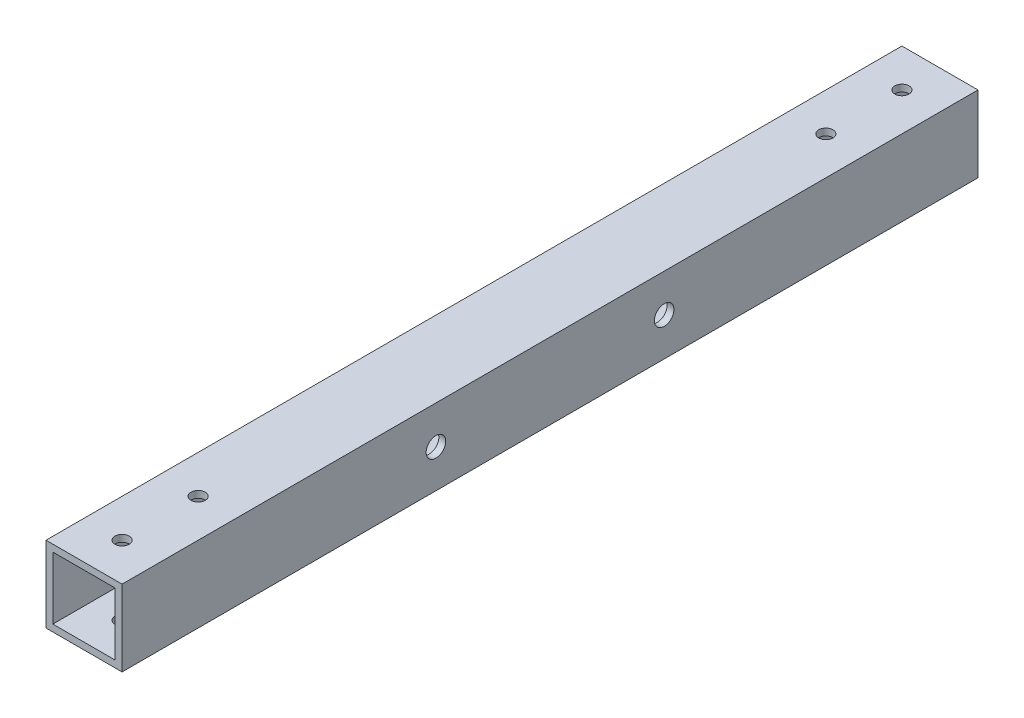
ISO-10303-21;
HEADER;
FILE_DESCRIPTION(('STEP AP214'),'2;1');
FILE_NAME('part.step','',(''),(''),'','','');
FILE_SCHEMA(('AUTOMOTIVE_DESIGN { 1 0 10303 214 1 1 1 1 }'));
ENDSEC;
DATA;
#1=APPLICATION_CONTEXT('core data for automotive mechanical design processes');
#2=APPLICATION_PROTOCOL_DEFINITION('international standard','automotive_design',2000,#1);
#3=PRODUCT_CONTEXT('',#1,'mechanical');
#4=PRODUCT('Part','Part','',(#3));
#5=PRODUCT_RELATED_PRODUCT_CATEGORY('part','',(#4));
#6=PRODUCT_DEFINITION_FORMATION('','',#4);
#7=PRODUCT_DEFINITION_CONTEXT('part definition',#1,'design');
#8=PRODUCT_DEFINITION('design','',#6,#7);
#9=PRODUCT_DEFINITION_SHAPE('','',#8);
#10=(LENGTH_UNIT() NAMED_UNIT(*) SI_UNIT(.MILLI.,.METRE.));
#11=(NAMED_UNIT(*) PLANE_ANGLE_UNIT() SI_UNIT($,.RADIAN.));
#12=(NAMED_UNIT(*) SI_UNIT($,.STERADIAN.) SOLID_ANGLE_UNIT());
#13=UNCERTAINTY_MEASURE_WITH_UNIT(LENGTH_MEASURE(1.E-05),#10,'distance_accuracy_value','');
#14=(GEOMETRIC_REPRESENTATION_CONTEXT(3) GLOBAL_UNCERTAINTY_ASSIGNED_CONTEXT((#13)) GLOBAL_UNIT_ASSIGNED_CONTEXT((#10,
#11,#12)) REPRESENTATION_CONTEXT('',''));
#15=CARTESIAN_POINT('',(0.,0.,0.));
#16=DIRECTION('',(0.,0.,1.));
#17=DIRECTION('',(1.,0.,0.));
#18=AXIS2_PLACEMENT_3D('',#15,#16,#17);
#19=CARTESIAN_POINT('',(12.7,12.7,285.75));
#20=DIRECTION('',(0.,-1.,0.));
#21=DIRECTION('',(1.,0.,0.));
#22=AXIS2_PLACEMENT_3D('',#19,#20,#21);
#23=PLANE('',#22);
#24=CARTESIAN_POINT('',(0.,12.7,273.05));
#25=DIRECTION('',(0.,1.,0.));
#26=DIRECTION('',(0.,0.,1.));
#27=AXIS2_PLACEMENT_3D('',#24,#25,#26);
#28=CIRCLE('',#27,2.38124999999999);
#29=CARTESIAN_POINT('',(0.,12.7,275.43125));
#30=VERTEX_POINT('',#29);
#31=EDGE_CURVE('E188',#30,#30,#28,.T.);
#32=ORIENTED_EDGE('',*,*,#31,.F.);
#33=EDGE_LOOP('',(#32));
#34=FACE_BOUND('',#33,.T.);
#35=CARTESIAN_POINT('',(0.,12.7,12.7));
#36=DIRECTION('',(0.,1.,0.));
#37=DIRECTION('',(0.,0.,1.));
#38=AXIS2_PLACEMENT_3D('',#35,#36,#37);
#39=CIRCLE('',#38,2.38124999999999);
#40=CARTESIAN_POINT('',(0.,12.7,15.08125));
#41=VERTEX_POINT('',#40);
#42=EDGE_CURVE('E213',#41,#41,#39,.T.);
#43=ORIENTED_EDGE('',*,*,#42,.F.);
#44=EDGE_LOOP('',(#43));
#45=FACE_BOUND('',#44,.T.);
#46=CARTESIAN_POINT('',(0.,12.7,38.1));
#47=DIRECTION('',(0.,1.,0.));
#48=DIRECTION('',(0.,0.,1.));
#49=AXIS2_PLACEMENT_3D('',#46,#47,#48);
#50=CIRCLE('',#49,2.38124999999999);
#51=CARTESIAN_POINT('',(0.,12.7,40.48125));
#52=VERTEX_POINT('',#51);
#53=EDGE_CURVE('E220',#52,#52,#50,.T.);
#54=ORIENTED_EDGE('',*,*,#53,.F.);
#55=EDGE_LOOP('',(#54));
#56=FACE_BOUND('',#55,.T.);
#57=DIRECTION('',(-1.,0.,0.));
#58=VECTOR('',#57,1.);
#59=CARTESIAN_POINT('',(12.7,12.7,0.));
#60=LINE('',#59,#58);
#61=CARTESIAN_POINT('',(12.7,12.7,0.));
#62=VERTEX_POINT('',#61);
#63=CARTESIAN_POINT('',(-12.7,12.7,0.));
#64=VERTEX_POINT('',#63);
#65=EDGE_CURVE('E142',#62,#64,#60,.T.);
#66=ORIENTED_EDGE('',*,*,#65,.T.);
#67=DIRECTION('',(0.,0.,-1.));
#68=VECTOR('',#67,1.);
#69=CARTESIAN_POINT('',(-12.7,12.7,285.75));
#70=LINE('',#69,#68);
#71=CARTESIAN_POINT('',(-12.7,12.7,285.75));
#72=VERTEX_POINT('',#71);
#73=EDGE_CURVE('E148',#72,#64,#70,.T.);
#74=ORIENTED_EDGE('',*,*,#73,.F.);
#75=DIRECTION('',(-1.,0.,0.));
#76=VECTOR('',#75,1.);
#77=CARTESIAN_POINT('',(12.7,12.7,285.75));
#78=LINE('',#77,#76);
#79=CARTESIAN_POINT('',(12.7,12.7,285.75));
#80=VERTEX_POINT('',#79);
#81=EDGE_CURVE('E146',#80,#72,#78,.T.);
#82=ORIENTED_EDGE('',*,*,#81,.F.);
#83=DIRECTION('',(0.,0.,-1.));
#84=VECTOR('',#83,1.);
#85=CARTESIAN_POINT('',(12.7,12.7,285.75));
#86=LINE('',#85,#84);
#87=EDGE_CURVE('E158',#80,#62,#86,.T.);
#88=ORIENTED_EDGE('',*,*,#87,.T.);
#89=EDGE_LOOP('',(#66,#74,#82,#88));
#90=FACE_BOUND('',#89,.T.);
#91=CARTESIAN_POINT('',(0.,12.7,247.65));
#92=DIRECTION('',(0.,1.,0.));
#93=DIRECTION('',(0.,0.,1.));
#94=AXIS2_PLACEMENT_3D('',#91,#92,#93);
#95=CIRCLE('',#94,2.38124999999999);
#96=CARTESIAN_POINT('',(0.,12.7,250.03125));
#97=VERTEX_POINT('',#96);
#98=EDGE_CURVE('E206',#97,#97,#95,.T.);
#99=ORIENTED_EDGE('',*,*,#98,.F.);
#100=EDGE_LOOP('',(#99));
#101=FACE_BOUND('',#100,.T.);
#102=ADVANCED_FACE('F32',(#34,#45,#56,#90,#101),#23,.F.);
#103=CARTESIAN_POINT('',(0.,0.,285.75));
#104=DIRECTION('',(0.,0.,1.));
#105=DIRECTION('',(1.,0.,0.));
#106=AXIS2_PLACEMENT_3D('',#103,#104,#105);
#107=PLANE('',#106);
#108=DIRECTION('',(0.,-1.,0.));
#109=VECTOR('',#108,1.);
#110=CARTESIAN_POINT('',(-12.7,-12.7,285.75));
#111=LINE('',#110,#109);
#112=CARTESIAN_POINT('',(-12.7,-12.7,285.75));
#113=VERTEX_POINT('',#112);
#114=EDGE_CURVE('E138',#72,#113,#111,.T.);
#115=ORIENTED_EDGE('',*,*,#114,.T.);
#116=DIRECTION('',(1.,0.,0.));
#117=VECTOR('',#116,1.);
#118=CARTESIAN_POINT('',(12.7,-12.7,285.75));
#119=LINE('',#118,#117);
#120=CARTESIAN_POINT('',(12.7,-12.7,285.75));
#121=VERTEX_POINT('',#120);
#122=EDGE_CURVE('E141',#113,#121,#119,.T.);
#123=ORIENTED_EDGE('',*,*,#122,.T.);
#124=DIRECTION('',(0.,1.,0.));
#125=VECTOR('',#124,1.);
#126=CARTESIAN_POINT('',(12.7,-12.7,285.75));
#127=LINE('',#126,#125);
#128=EDGE_CURVE('E144',#121,#80,#127,.T.);
#129=ORIENTED_EDGE('',*,*,#128,.T.);
#130=ORIENTED_EDGE('',*,*,#81,.T.);
#131=EDGE_LOOP('',(#115,#123,#129,#130));
#132=FACE_BOUND('',#131,.T.);
#133=DIRECTION('',(-1.,0.,0.));
#134=VECTOR('',#133,1.);
#135=CARTESIAN_POINT('',(10.414,10.414,285.75));
#136=LINE('',#135,#134);
#137=CARTESIAN_POINT('',(10.414,10.414,285.75));
#138=VERTEX_POINT('',#137);
#139=CARTESIAN_POINT('',(-10.414,10.414,285.75));
#140=VERTEX_POINT('',#139);
#141=EDGE_CURVE('E107',#138,#140,#136,.T.);
#142=ORIENTED_EDGE('',*,*,#141,.F.);
#143=DIRECTION('',(0.,1.,0.));
#144=VECTOR('',#143,1.);
#145=CARTESIAN_POINT('',(10.414,-10.414,285.75));
#146=LINE('',#145,#144);
#147=CARTESIAN_POINT('',(10.414,-10.414,285.75));
#148=VERTEX_POINT('',#147);
#149=EDGE_CURVE('E99',#148,#138,#146,.T.);
#150=ORIENTED_EDGE('',*,*,#149,.F.);
#151=DIRECTION('',(1.,0.,0.));
#152=VECTOR('',#151,1.);
#153=CARTESIAN_POINT('',(10.414,-10.414,285.75));
#154=LINE('',#153,#152);
#155=CARTESIAN_POINT('',(-10.414,-10.414,285.75));
#156=VERTEX_POINT('',#155);
#157=EDGE_CURVE('E122',#156,#148,#154,.T.);
#158=ORIENTED_EDGE('',*,*,#157,.F.);
#159=DIRECTION('',(0.,-1.,0.));
#160=VECTOR('',#159,1.);
#161=CARTESIAN_POINT('',(-10.414,-10.414,285.75));
#162=LINE('',#161,#160);
#163=EDGE_CURVE('E120',#140,#156,#162,.T.);
#164=ORIENTED_EDGE('',*,*,#163,.F.);
#165=EDGE_LOOP('',(#142,#150,#158,#164));
#166=FACE_BOUND('',#165,.T.);
#167=ADVANCED_FACE('F119',(#132,#166),#107,.T.);
#168=CARTESIAN_POINT('',(0.,0.,0.));
#169=DIRECTION('',(0.,0.,1.));
#170=DIRECTION('',(1.,0.,0.));
#171=AXIS2_PLACEMENT_3D('',#168,#169,#170);
#172=PLANE('',#171);
#173=DIRECTION('',(0.,-1.,0.));
#174=VECTOR('',#173,1.);
#175=CARTESIAN_POINT('',(-12.7,-12.7,0.));
#176=LINE('',#175,#174);
#177=CARTESIAN_POINT('',(-12.7,-12.7,0.));
#178=VERTEX_POINT('',#177);
#179=EDGE_CURVE('E115',#64,#178,#176,.T.);
#180=ORIENTED_EDGE('',*,*,#179,.F.);
#181=ORIENTED_EDGE('',*,*,#65,.F.);
#182=DIRECTION('',(0.,1.,0.));
#183=VECTOR('',#182,1.);
#184=CARTESIAN_POINT('',(12.7,-12.7,0.));
#185=LINE('',#184,#183);
#186=CARTESIAN_POINT('',(12.7,-12.7,0.));
#187=VERTEX_POINT('',#186);
#188=EDGE_CURVE('E153',#187,#62,#185,.T.);
#189=ORIENTED_EDGE('',*,*,#188,.F.);
#190=DIRECTION('',(1.,0.,0.));
#191=VECTOR('',#190,1.);
#192=CARTESIAN_POINT('',(12.7,-12.7,0.));
#193=LINE('',#192,#191);
#194=EDGE_CURVE('E151',#178,#187,#193,.T.);
#195=ORIENTED_EDGE('',*,*,#194,.F.);
#196=EDGE_LOOP('',(#180,#181,#189,#195));
#197=FACE_BOUND('',#196,.T.);
#198=DIRECTION('',(0.,1.,0.));
#199=VECTOR('',#198,1.);
#200=CARTESIAN_POINT('',(10.414,-10.414,0.));
#201=LINE('',#200,#199);
#202=CARTESIAN_POINT('',(10.414,-10.414,0.));
#203=VERTEX_POINT('',#202);
#204=CARTESIAN_POINT('',(10.414,10.414,0.));
#205=VERTEX_POINT('',#204);
#206=EDGE_CURVE('E57',#203,#205,#201,.T.);
#207=ORIENTED_EDGE('',*,*,#206,.T.);
#208=DIRECTION('',(-1.,0.,0.));
#209=VECTOR('',#208,1.);
#210=CARTESIAN_POINT('',(10.414,10.414,0.));
#211=LINE('',#210,#209);
#212=CARTESIAN_POINT('',(-10.414,10.414,0.));
#213=VERTEX_POINT('',#212);
#214=EDGE_CURVE('E114',#205,#213,#211,.T.);
#215=ORIENTED_EDGE('',*,*,#214,.T.);
#216=DIRECTION('',(0.,-1.,0.));
#217=VECTOR('',#216,1.);
#218=CARTESIAN_POINT('',(-10.414,-10.414,0.));
#219=LINE('',#218,#217);
#220=CARTESIAN_POINT('',(-10.414,-10.414,0.));
#221=VERTEX_POINT('',#220);
#222=EDGE_CURVE('E130',#213,#221,#219,.T.);
#223=ORIENTED_EDGE('',*,*,#222,.T.);
#224=DIRECTION('',(1.,0.,0.));
#225=VECTOR('',#224,1.);
#226=CARTESIAN_POINT('',(10.414,-10.414,0.));
#227=LINE('',#226,#225);
#228=EDGE_CURVE('E108',#221,#203,#227,.T.);
#229=ORIENTED_EDGE('',*,*,#228,.T.);
#230=EDGE_LOOP('',(#207,#215,#223,#229));
#231=FACE_BOUND('',#230,.T.);
#232=ADVANCED_FACE('F252',(#197,#231),#172,.F.);
#233=CARTESIAN_POINT('',(-12.7,-12.7,285.75));
#234=DIRECTION('',(1.,0.,0.));
#235=DIRECTION('',(0.,0.,-1.));
#236=AXIS2_PLACEMENT_3D('',#233,#234,#235);
#237=PLANE('',#236);
#238=CARTESIAN_POINT('',(-12.7,0.,180.975));
#239=DIRECTION('',(1.,0.,0.));
#240=DIRECTION('',(0.,0.,-1.));
#241=AXIS2_PLACEMENT_3D('',#238,#239,#240);
#242=CIRCLE('',#241,3.2639);
#243=CARTESIAN_POINT('',(-12.7,0.,177.7111));
#244=VERTEX_POINT('',#243);
#245=EDGE_CURVE('E413',#244,#244,#242,.T.);
#246=ORIENTED_EDGE('',*,*,#245,.T.);
#247=EDGE_LOOP('',(#246));
#248=FACE_BOUND('',#247,.T.);
#249=CARTESIAN_POINT('',(-12.7,0.,104.775));
#250=DIRECTION('',(1.,0.,0.));
#251=DIRECTION('',(0.,0.,-1.));
#252=AXIS2_PLACEMENT_3D('',#249,#250,#251);
#253=CIRCLE('',#252,3.2639);
#254=CARTESIAN_POINT('',(-12.7,0.,101.5111));
#255=VERTEX_POINT('',#254);
#256=EDGE_CURVE('E184',#255,#255,#253,.T.);
#257=ORIENTED_EDGE('',*,*,#256,.T.);
#258=EDGE_LOOP('',(#257));
#259=FACE_BOUND('',#258,.T.);
#260=ORIENTED_EDGE('',*,*,#179,.T.);
#261=DIRECTION('',(0.,0.,-1.));
#262=VECTOR('',#261,1.);
#263=CARTESIAN_POINT('',(-12.7,-12.7,285.75));
#264=LINE('',#263,#262);
#265=EDGE_CURVE('E11',#113,#178,#264,.T.);
#266=ORIENTED_EDGE('',*,*,#265,.F.);
#267=ORIENTED_EDGE('',*,*,#114,.F.);
#268=ORIENTED_EDGE('',*,*,#73,.T.);
#269=EDGE_LOOP('',(#260,#266,#267,#268));
#270=FACE_BOUND('',#269,.T.);
#271=ADVANCED_FACE('F34',(#248,#259,#270),#237,.F.);
#272=CARTESIAN_POINT('',(12.7,-12.7,285.75));
#273=DIRECTION('',(0.,1.,0.));
#274=DIRECTION('',(-1.,0.,0.));
#275=AXIS2_PLACEMENT_3D('',#272,#273,#274);
#276=PLANE('',#275);
#277=CARTESIAN_POINT('',(0.,-12.7,273.05));
#278=DIRECTION('',(0.,1.,0.));
#279=DIRECTION('',(0.,0.,1.));
#280=AXIS2_PLACEMENT_3D('',#277,#278,#279);
#281=CIRCLE('',#280,2.38124999999998);
#282=CARTESIAN_POINT('',(0.,-12.7,275.43125));
#283=VERTEX_POINT('',#282);
#284=EDGE_CURVE('E180',#283,#283,#281,.T.);
#285=ORIENTED_EDGE('',*,*,#284,.T.);
#286=EDGE_LOOP('',(#285));
#287=FACE_BOUND('',#286,.T.);
#288=CARTESIAN_POINT('',(0.,-12.7,247.65));
#289=DIRECTION('',(0.,1.,0.));
#290=DIRECTION('',(0.,0.,1.));
#291=AXIS2_PLACEMENT_3D('',#288,#289,#290);
#292=CIRCLE('',#291,2.38124999999998);
#293=CARTESIAN_POINT('',(0.,-12.7,250.03125));
#294=VERTEX_POINT('',#293);
#295=EDGE_CURVE('E176',#294,#294,#292,.T.);
#296=ORIENTED_EDGE('',*,*,#295,.T.);
#297=EDGE_LOOP('',(#296));
#298=FACE_BOUND('',#297,.T.);
#299=CARTESIAN_POINT('',(0.,-12.7,12.7));
#300=DIRECTION('',(0.,1.,0.));
#301=DIRECTION('',(0.,0.,1.));
#302=AXIS2_PLACEMENT_3D('',#299,#300,#301);
#303=CIRCLE('',#302,2.38124999999998);
#304=CARTESIAN_POINT('',(0.,-12.7,15.08125));
#305=VERTEX_POINT('',#304);
#306=EDGE_CURVE('E171',#305,#305,#303,.T.);
#307=ORIENTED_EDGE('',*,*,#306,.T.);
#308=EDGE_LOOP('',(#307));
#309=FACE_BOUND('',#308,.T.);
#310=CARTESIAN_POINT('',(0.,-12.7,38.1));
#311=DIRECTION('',(0.,1.,0.));
#312=DIRECTION('',(0.,0.,1.));
#313=AXIS2_PLACEMENT_3D('',#310,#311,#312);
#314=CIRCLE('',#313,2.38124999999998);
#315=CARTESIAN_POINT('',(0.,-12.7,40.48125));
#316=VERTEX_POINT('',#315);
#317=EDGE_CURVE('E166',#316,#316,#314,.T.);
#318=ORIENTED_EDGE('',*,*,#317,.T.);
#319=EDGE_LOOP('',(#318));
#320=FACE_BOUND('',#319,.T.);
#321=ORIENTED_EDGE('',*,*,#194,.T.);
#322=DIRECTION('',(0.,0.,-1.));
#323=VECTOR('',#322,1.);
#324=CARTESIAN_POINT('',(12.7,-12.7,285.75));
#325=LINE('',#324,#323);
#326=EDGE_CURVE('E41',#121,#187,#325,.T.);
#327=ORIENTED_EDGE('',*,*,#326,.F.);
#328=ORIENTED_EDGE('',*,*,#122,.F.);
#329=ORIENTED_EDGE('',*,*,#265,.T.);
#330=EDGE_LOOP('',(#321,#327,#328,#329));
#331=FACE_BOUND('',#330,.T.);
#332=ADVANCED_FACE('F260',(#287,#298,#309,#320,#331),#276,.F.);
#333=CARTESIAN_POINT('',(12.7,-12.7,285.75));
#334=DIRECTION('',(-1.,0.,0.));
#335=DIRECTION('',(0.,0.,1.));
#336=AXIS2_PLACEMENT_3D('',#333,#334,#335);
#337=PLANE('',#336);
#338=CARTESIAN_POINT('',(12.7,0.,180.975));
#339=DIRECTION('',(1.,0.,0.));
#340=DIRECTION('',(0.,0.,-1.));
#341=AXIS2_PLACEMENT_3D('',#338,#339,#340);
#342=CIRCLE('',#341,3.26389999999999);
#343=CARTESIAN_POINT('',(12.7,0.,177.7111));
#344=VERTEX_POINT('',#343);
#345=EDGE_CURVE('E412',#344,#344,#342,.T.);
#346=ORIENTED_EDGE('',*,*,#345,.F.);
#347=EDGE_LOOP('',(#346));
#348=FACE_BOUND('',#347,.T.);
#349=CARTESIAN_POINT('',(12.7,0.,104.775));
#350=DIRECTION('',(1.,0.,0.));
#351=DIRECTION('',(0.,0.,-1.));
#352=AXIS2_PLACEMENT_3D('',#349,#350,#351);
#353=CIRCLE('',#352,3.26389999999999);
#354=CARTESIAN_POINT('',(12.7,0.,101.5111));
#355=VERTEX_POINT('',#354);
#356=EDGE_CURVE('E191',#355,#355,#353,.T.);
#357=ORIENTED_EDGE('',*,*,#356,.F.);
#358=EDGE_LOOP('',(#357));
#359=FACE_BOUND('',#358,.T.);
#360=ORIENTED_EDGE('',*,*,#188,.T.);
#361=ORIENTED_EDGE('',*,*,#87,.F.);
#362=ORIENTED_EDGE('',*,*,#128,.F.);
#363=ORIENTED_EDGE('',*,*,#326,.T.);
#364=EDGE_LOOP('',(#360,#361,#362,#363));
#365=FACE_BOUND('',#364,.T.);
#366=ADVANCED_FACE('F241',(#348,#359,#365),#337,.F.);
#367=CARTESIAN_POINT('',(10.414,-10.414,285.75));
#368=DIRECTION('',(-1.,0.,0.));
#369=DIRECTION('',(0.,0.,1.));
#370=AXIS2_PLACEMENT_3D('',#367,#368,#369);
#371=PLANE('',#370);
#372=CARTESIAN_POINT('',(10.414,0.,180.975));
#373=DIRECTION('',(-1.,0.,0.));
#374=DIRECTION('',(0.,0.,1.));
#375=AXIS2_PLACEMENT_3D('',#372,#373,#374);
#376=CIRCLE('',#375,3.26389999999999);
#377=CARTESIAN_POINT('',(10.414,0.,184.2389));
#378=VERTEX_POINT('',#377);
#379=EDGE_CURVE('E196',#378,#378,#376,.T.);
#380=ORIENTED_EDGE('',*,*,#379,.F.);
#381=EDGE_LOOP('',(#380));
#382=FACE_BOUND('',#381,.T.);
#383=CARTESIAN_POINT('',(10.414,0.,104.775));
#384=DIRECTION('',(-1.,0.,0.));
#385=DIRECTION('',(0.,0.,1.));
#386=AXIS2_PLACEMENT_3D('',#383,#384,#385);
#387=CIRCLE('',#386,3.26389999999999);
#388=CARTESIAN_POINT('',(10.414,0.,108.0389));
#389=VERTEX_POINT('',#388);
#390=EDGE_CURVE('E183',#389,#389,#387,.T.);
#391=ORIENTED_EDGE('',*,*,#390,.F.);
#392=EDGE_LOOP('',(#391));
#393=FACE_BOUND('',#392,.T.);
#394=ORIENTED_EDGE('',*,*,#206,.F.);
#395=DIRECTION('',(0.,0.,-1.));
#396=VECTOR('',#395,1.);
#397=CARTESIAN_POINT('',(10.414,-10.414,285.75));
#398=LINE('',#397,#396);
#399=EDGE_CURVE('E103',#148,#203,#398,.T.);
#400=ORIENTED_EDGE('',*,*,#399,.F.);
#401=ORIENTED_EDGE('',*,*,#149,.T.);
#402=DIRECTION('',(0.,0.,-1.));
#403=VECTOR('',#402,1.);
#404=CARTESIAN_POINT('',(10.414,10.414,285.75));
#405=LINE('',#404,#403);
#406=EDGE_CURVE('E102',#138,#205,#405,.T.);
#407=ORIENTED_EDGE('',*,*,#406,.T.);
#408=EDGE_LOOP('',(#394,#400,#401,#407));
#409=FACE_BOUND('',#408,.T.);
#410=ADVANCED_FACE('F101',(#382,#393,#409),#371,.T.);
#411=CARTESIAN_POINT('',(10.414,10.414,285.75));
#412=DIRECTION('',(0.,-1.,0.));
#413=DIRECTION('',(0.,0.,-1.));
#414=AXIS2_PLACEMENT_3D('',#411,#412,#413);
#415=PLANE('',#414);
#416=CARTESIAN_POINT('',(0.,10.414,273.05));
#417=DIRECTION('',(0.,-1.,0.));
#418=DIRECTION('',(0.,0.,-1.));
#419=AXIS2_PLACEMENT_3D('',#416,#417,#418);
#420=CIRCLE('',#419,2.38124999999999);
#421=CARTESIAN_POINT('',(0.,10.414,270.66875));
#422=VERTEX_POINT('',#421);
#423=EDGE_CURVE('E177',#422,#422,#420,.T.);
#424=ORIENTED_EDGE('',*,*,#423,.F.);
#425=EDGE_LOOP('',(#424));
#426=FACE_BOUND('',#425,.T.);
#427=CARTESIAN_POINT('',(0.,10.414,247.65));
#428=DIRECTION('',(0.,-1.,0.));
#429=DIRECTION('',(0.,0.,-1.));
#430=AXIS2_PLACEMENT_3D('',#427,#428,#429);
#431=CIRCLE('',#430,2.38124999999999);
#432=CARTESIAN_POINT('',(0.,10.414,245.26875));
#433=VERTEX_POINT('',#432);
#434=EDGE_CURVE('E175',#433,#433,#431,.T.);
#435=ORIENTED_EDGE('',*,*,#434,.F.);
#436=EDGE_LOOP('',(#435));
#437=FACE_BOUND('',#436,.T.);
#438=CARTESIAN_POINT('',(0.,10.414,12.7));
#439=DIRECTION('',(0.,-1.,0.));
#440=DIRECTION('',(0.,0.,-1.));
#441=AXIS2_PLACEMENT_3D('',#438,#439,#440);
#442=CIRCLE('',#441,2.38124999999999);
#443=CARTESIAN_POINT('',(0.,10.414,10.31875));
#444=VERTEX_POINT('',#443);
#445=EDGE_CURVE('E167',#444,#444,#442,.T.);
#446=ORIENTED_EDGE('',*,*,#445,.F.);
#447=EDGE_LOOP('',(#446));
#448=FACE_BOUND('',#447,.T.);
#449=CARTESIAN_POINT('',(0.,10.414,38.1));
#450=DIRECTION('',(0.,-1.,0.));
#451=DIRECTION('',(0.,0.,-1.));
#452=AXIS2_PLACEMENT_3D('',#449,#450,#451);
#453=CIRCLE('',#452,2.38124999999999);
#454=CARTESIAN_POINT('',(0.,10.414,35.71875));
#455=VERTEX_POINT('',#454);
#456=EDGE_CURVE('E128',#455,#455,#453,.T.);
#457=ORIENTED_EDGE('',*,*,#456,.F.);
#458=EDGE_LOOP('',(#457));
#459=FACE_BOUND('',#458,.T.);
#460=ORIENTED_EDGE('',*,*,#214,.F.);
#461=ORIENTED_EDGE('',*,*,#406,.F.);
#462=ORIENTED_EDGE('',*,*,#141,.T.);
#463=DIRECTION('',(0.,0.,-1.));
#464=VECTOR('',#463,1.);
#465=CARTESIAN_POINT('',(-10.414,10.414,285.75));
#466=LINE('',#465,#464);
#467=EDGE_CURVE('E116',#140,#213,#466,.T.);
#468=ORIENTED_EDGE('',*,*,#467,.T.);
#469=EDGE_LOOP('',(#460,#461,#462,#468));
#470=FACE_BOUND('',#469,.T.);
#471=ADVANCED_FACE('F111',(#426,#437,#448,#459,#470),#415,.T.);
#472=CARTESIAN_POINT('',(-10.414,-10.414,285.75));
#473=DIRECTION('',(1.,0.,0.));
#474=DIRECTION('',(0.,0.,-1.));
#475=AXIS2_PLACEMENT_3D('',#472,#473,#474);
#476=PLANE('',#475);
#477=CARTESIAN_POINT('',(-10.414,0.,180.975));
#478=DIRECTION('',(1.,0.,0.));
#479=DIRECTION('',(0.,0.,-1.));
#480=AXIS2_PLACEMENT_3D('',#477,#478,#479);
#481=CIRCLE('',#480,3.26389999999999);
#482=CARTESIAN_POINT('',(-10.414,0.,177.7111));
#483=VERTEX_POINT('',#482);
#484=EDGE_CURVE('E36',#483,#483,#481,.T.);
#485=ORIENTED_EDGE('',*,*,#484,.F.);
#486=EDGE_LOOP('',(#485));
#487=FACE_BOUND('',#486,.T.);
#488=CARTESIAN_POINT('',(-10.414,0.,104.775));
#489=DIRECTION('',(1.,0.,0.));
#490=DIRECTION('',(0.,0.,-1.));
#491=AXIS2_PLACEMENT_3D('',#488,#489,#490);
#492=CIRCLE('',#491,3.26389999999999);
#493=CARTESIAN_POINT('',(-10.414,0.,101.5111));
#494=VERTEX_POINT('',#493);
#495=EDGE_CURVE('E181',#494,#494,#492,.T.);
#496=ORIENTED_EDGE('',*,*,#495,.F.);
#497=EDGE_LOOP('',(#496));
#498=FACE_BOUND('',#497,.T.);
#499=ORIENTED_EDGE('',*,*,#222,.F.);
#500=ORIENTED_EDGE('',*,*,#467,.F.);
#501=ORIENTED_EDGE('',*,*,#163,.T.);
#502=DIRECTION('',(0.,0.,-1.));
#503=VECTOR('',#502,1.);
#504=CARTESIAN_POINT('',(-10.414,-10.414,285.75));
#505=LINE('',#504,#503);
#506=EDGE_CURVE('E49',#156,#221,#505,.T.);
#507=ORIENTED_EDGE('',*,*,#506,.T.);
#508=EDGE_LOOP('',(#499,#500,#501,#507));
#509=FACE_BOUND('',#508,.T.);
#510=ADVANCED_FACE('F231',(#487,#498,#509),#476,.T.);
#511=CARTESIAN_POINT('',(10.414,-10.414,285.75));
#512=DIRECTION('',(0.,1.,0.));
#513=DIRECTION('',(0.,0.,1.));
#514=AXIS2_PLACEMENT_3D('',#511,#512,#513);
#515=PLANE('',#514);
#516=CARTESIAN_POINT('',(0.,-10.414,273.05));
#517=DIRECTION('',(0.,1.,0.));
#518=DIRECTION('',(0.,0.,1.));
#519=AXIS2_PLACEMENT_3D('',#516,#517,#518);
#520=CIRCLE('',#519,2.38124999999999);
#521=CARTESIAN_POINT('',(0.,-10.414,275.43125));
#522=VERTEX_POINT('',#521);
#523=EDGE_CURVE('E179',#522,#522,#520,.T.);
#524=ORIENTED_EDGE('',*,*,#523,.F.);
#525=EDGE_LOOP('',(#524));
#526=FACE_BOUND('',#525,.T.);
#527=CARTESIAN_POINT('',(0.,-10.414,247.65));
#528=DIRECTION('',(0.,1.,0.));
#529=DIRECTION('',(0.,0.,1.));
#530=AXIS2_PLACEMENT_3D('',#527,#528,#529);
#531=CIRCLE('',#530,2.38124999999999);
#532=CARTESIAN_POINT('',(0.,-10.414,250.03125));
#533=VERTEX_POINT('',#532);
#534=EDGE_CURVE('E172',#533,#533,#531,.T.);
#535=ORIENTED_EDGE('',*,*,#534,.F.);
#536=EDGE_LOOP('',(#535));
#537=FACE_BOUND('',#536,.T.);
#538=CARTESIAN_POINT('',(0.,-10.414,12.7));
#539=DIRECTION('',(0.,1.,0.));
#540=DIRECTION('',(0.,0.,1.));
#541=AXIS2_PLACEMENT_3D('',#538,#539,#540);
#542=CIRCLE('',#541,2.38124999999999);
#543=CARTESIAN_POINT('',(0.,-10.414,15.08125));
#544=VERTEX_POINT('',#543);
#545=EDGE_CURVE('E170',#544,#544,#542,.T.);
#546=ORIENTED_EDGE('',*,*,#545,.F.);
#547=EDGE_LOOP('',(#546));
#548=FACE_BOUND('',#547,.T.);
#549=CARTESIAN_POINT('',(0.,-10.414,38.1));
#550=DIRECTION('',(0.,1.,0.));
#551=DIRECTION('',(0.,0.,1.));
#552=AXIS2_PLACEMENT_3D('',#549,#550,#551);
#553=CIRCLE('',#552,2.38124999999999);
#554=CARTESIAN_POINT('',(0.,-10.414,40.48125));
#555=VERTEX_POINT('',#554);
#556=EDGE_CURVE('E163',#555,#555,#553,.T.);
#557=ORIENTED_EDGE('',*,*,#556,.F.);
#558=EDGE_LOOP('',(#557));
#559=FACE_BOUND('',#558,.T.);
#560=ORIENTED_EDGE('',*,*,#228,.F.);
#561=ORIENTED_EDGE('',*,*,#506,.F.);
#562=ORIENTED_EDGE('',*,*,#157,.T.);
#563=ORIENTED_EDGE('',*,*,#399,.T.);
#564=EDGE_LOOP('',(#560,#561,#562,#563));
#565=FACE_BOUND('',#564,.T.);
#566=ADVANCED_FACE('F238',(#526,#537,#548,#559,#565),#515,.T.);
#567=CARTESIAN_POINT('',(0.,12.7,38.1));
#568=DIRECTION('',(0.,1.,0.));
#569=DIRECTION('',(0.,0.,1.));
#570=AXIS2_PLACEMENT_3D('',#567,#568,#569);
#571=CYLINDRICAL_SURFACE('',#570,2.38124999999999);
#572=ORIENTED_EDGE('',*,*,#556,.T.);
#573=EDGE_LOOP('',(#572));
#574=FACE_BOUND('',#573,.T.);
#575=ORIENTED_EDGE('',*,*,#317,.F.);
#576=EDGE_LOOP('',(#575));
#577=FACE_BOUND('',#576,.T.);
#578=ADVANCED_FACE('F315',(#574,#577),#571,.F.);
#579=ORIENTED_EDGE('',*,*,#456,.T.);
#580=EDGE_LOOP('',(#579));
#581=FACE_BOUND('',#580,.T.);
#582=ORIENTED_EDGE('',*,*,#53,.T.);
#583=EDGE_LOOP('',(#582));
#584=FACE_BOUND('',#583,.T.);
#585=ADVANCED_FACE('F227',(#581,#584),#571,.F.);
#586=CARTESIAN_POINT('',(0.,12.7,12.7));
#587=DIRECTION('',(0.,1.,0.));
#588=DIRECTION('',(0.,0.,1.));
#589=AXIS2_PLACEMENT_3D('',#586,#587,#588);
#590=CYLINDRICAL_SURFACE('',#589,2.38124999999999);
#591=ORIENTED_EDGE('',*,*,#445,.T.);
#592=EDGE_LOOP('',(#591));
#593=FACE_BOUND('',#592,.T.);
#594=ORIENTED_EDGE('',*,*,#42,.T.);
#595=EDGE_LOOP('',(#594));
#596=FACE_BOUND('',#595,.T.);
#597=ADVANCED_FACE('F311',(#593,#596),#590,.F.);
#598=ORIENTED_EDGE('',*,*,#545,.T.);
#599=EDGE_LOOP('',(#598));
#600=FACE_BOUND('',#599,.T.);
#601=ORIENTED_EDGE('',*,*,#306,.F.);
#602=EDGE_LOOP('',(#601));
#603=FACE_BOUND('',#602,.T.);
#604=ADVANCED_FACE('F307',(#600,#603),#590,.F.);
#605=CARTESIAN_POINT('',(0.,12.7,247.65));
#606=DIRECTION('',(0.,1.,0.));
#607=DIRECTION('',(0.,0.,1.));
#608=AXIS2_PLACEMENT_3D('',#605,#606,#607);
#609=CYLINDRICAL_SURFACE('',#608,2.38124999999999);
#610=ORIENTED_EDGE('',*,*,#534,.T.);
#611=EDGE_LOOP('',(#610));
#612=FACE_BOUND('',#611,.T.);
#613=ORIENTED_EDGE('',*,*,#295,.F.);
#614=EDGE_LOOP('',(#613));
#615=FACE_BOUND('',#614,.T.);
#616=ADVANCED_FACE('F297',(#612,#615),#609,.F.);
#617=ORIENTED_EDGE('',*,*,#434,.T.);
#618=EDGE_LOOP('',(#617));
#619=FACE_BOUND('',#618,.T.);
#620=ORIENTED_EDGE('',*,*,#98,.T.);
#621=EDGE_LOOP('',(#620));
#622=FACE_BOUND('',#621,.T.);
#623=ADVANCED_FACE('F294',(#619,#622),#609,.F.);
#624=CARTESIAN_POINT('',(0.,12.7,273.05));
#625=DIRECTION('',(0.,1.,0.));
#626=DIRECTION('',(0.,0.,1.));
#627=AXIS2_PLACEMENT_3D('',#624,#625,#626);
#628=CYLINDRICAL_SURFACE('',#627,2.38124999999999);
#629=ORIENTED_EDGE('',*,*,#423,.T.);
#630=EDGE_LOOP('',(#629));
#631=FACE_BOUND('',#630,.T.);
#632=ORIENTED_EDGE('',*,*,#31,.T.);
#633=EDGE_LOOP('',(#632));
#634=FACE_BOUND('',#633,.T.);
#635=ADVANCED_FACE('F296',(#631,#634),#628,.F.);
#636=ORIENTED_EDGE('',*,*,#523,.T.);
#637=EDGE_LOOP('',(#636));
#638=FACE_BOUND('',#637,.T.);
#639=ORIENTED_EDGE('',*,*,#284,.F.);
#640=EDGE_LOOP('',(#639));
#641=FACE_BOUND('',#640,.T.);
#642=ADVANCED_FACE('F304',(#638,#641),#628,.F.);
#643=CARTESIAN_POINT('',(12.7,0.,104.775));
#644=DIRECTION('',(1.,0.,0.));
#645=DIRECTION('',(0.,0.,-1.));
#646=AXIS2_PLACEMENT_3D('',#643,#644,#645);
#647=CYLINDRICAL_SURFACE('',#646,3.26389999999999);
#648=ORIENTED_EDGE('',*,*,#495,.T.);
#649=EDGE_LOOP('',(#648));
#650=FACE_BOUND('',#649,.T.);
#651=ORIENTED_EDGE('',*,*,#256,.F.);
#652=EDGE_LOOP('',(#651));
#653=FACE_BOUND('',#652,.T.);
#654=ADVANCED_FACE('F372',(#650,#653),#647,.F.);
#655=ORIENTED_EDGE('',*,*,#390,.T.);
#656=EDGE_LOOP('',(#655));
#657=FACE_BOUND('',#656,.T.);
#658=ORIENTED_EDGE('',*,*,#356,.T.);
#659=EDGE_LOOP('',(#658));
#660=FACE_BOUND('',#659,.T.);
#661=ADVANCED_FACE('F377',(#657,#660),#647,.F.);
#662=CARTESIAN_POINT('',(12.7,0.,180.975));
#663=DIRECTION('',(1.,0.,0.));
#664=DIRECTION('',(0.,0.,-1.));
#665=AXIS2_PLACEMENT_3D('',#662,#663,#664);
#666=CYLINDRICAL_SURFACE('',#665,3.26389999999999);
#667=ORIENTED_EDGE('',*,*,#484,.T.);
#668=EDGE_LOOP('',(#667));
#669=FACE_BOUND('',#668,.T.);
#670=ORIENTED_EDGE('',*,*,#245,.F.);
#671=EDGE_LOOP('',(#670));
#672=FACE_BOUND('',#671,.T.);
#673=ADVANCED_FACE('F385',(#669,#672),#666,.F.);
#674=ORIENTED_EDGE('',*,*,#379,.T.);
#675=EDGE_LOOP('',(#674));
#676=FACE_BOUND('',#675,.T.);
#677=ORIENTED_EDGE('',*,*,#345,.T.);
#678=EDGE_LOOP('',(#677));
#679=FACE_BOUND('',#678,.T.);
#680=ADVANCED_FACE('F394',(#676,#679),#666,.F.);
#681=CLOSED_SHELL('',(#102,#167,#232,#271,#332,#366,#410,#471,#510,#566,#578,#585,#597,#604,
#616,#623,#635,#642,#654,#661,#673,#680));
#682=MANIFOLD_SOLID_BREP('B2',#681);
#683=ADVANCED_BREP_SHAPE_REPRESENTATION('',(#18,#682),#14);
#684=SHAPE_DEFINITION_REPRESENTATION(#9,#683);
ENDSEC;
END-ISO-10303-21;
